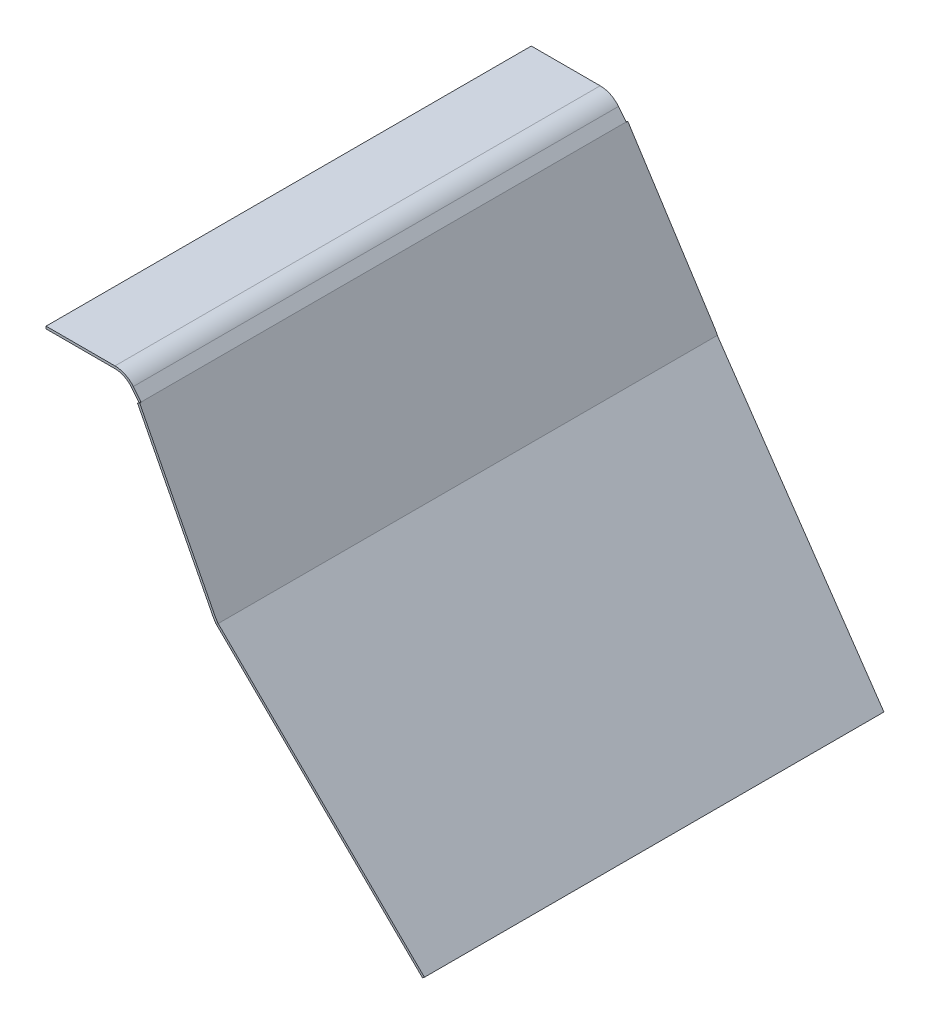
ISO-10303-21;
HEADER;
FILE_DESCRIPTION(('STEP AP214'),'2;1');
FILE_NAME('part.step','',(''),(''),'','','');
FILE_SCHEMA(('AUTOMOTIVE_DESIGN { 1 0 10303 214 1 1 1 1 }'));
ENDSEC;
DATA;
#1=APPLICATION_CONTEXT('core data for automotive mechanical design processes');
#2=APPLICATION_PROTOCOL_DEFINITION('international standard','automotive_design',2000,#1);
#3=PRODUCT_CONTEXT('',#1,'mechanical');
#4=PRODUCT('Part','Part','',(#3));
#5=PRODUCT_RELATED_PRODUCT_CATEGORY('part','',(#4));
#6=PRODUCT_DEFINITION_FORMATION('','',#4);
#7=PRODUCT_DEFINITION_CONTEXT('part definition',#1,'design');
#8=PRODUCT_DEFINITION('design','',#6,#7);
#9=PRODUCT_DEFINITION_SHAPE('','',#8);
#10=(LENGTH_UNIT() NAMED_UNIT(*) SI_UNIT(.MILLI.,.METRE.));
#11=(NAMED_UNIT(*) PLANE_ANGLE_UNIT() SI_UNIT($,.RADIAN.));
#12=(NAMED_UNIT(*) SI_UNIT($,.STERADIAN.) SOLID_ANGLE_UNIT());
#13=UNCERTAINTY_MEASURE_WITH_UNIT(LENGTH_MEASURE(1.E-05),#10,'distance_accuracy_value','');
#14=(GEOMETRIC_REPRESENTATION_CONTEXT(3) GLOBAL_UNCERTAINTY_ASSIGNED_CONTEXT((#13)) GLOBAL_UNIT_ASSIGNED_CONTEXT((#10,
#11,#12)) REPRESENTATION_CONTEXT('',''));
#15=CARTESIAN_POINT('',(0.,0.,0.));
#16=DIRECTION('',(0.,0.,1.));
#17=DIRECTION('',(1.,0.,0.));
#18=AXIS2_PLACEMENT_3D('',#15,#16,#17);
#19=CARTESIAN_POINT('',(209.743213645156,98.1461517212022,0.));
#20=DIRECTION('',(0.641429269385998,-0.767182176783941,0.));
#21=DIRECTION('',(0.,0.,1.));
#22=AXIS2_PLACEMENT_3D('',#19,#20,#21);
#23=PLANE('',#22);
#24=DIRECTION('',(0.,0.,1.));
#25=VECTOR('',#24,1.);
#26=CARTESIAN_POINT('',(212.044760175508,100.07043952936,0.));
#27=LINE('',#26,#25);
#28=CARTESIAN_POINT('',(212.044760175508,100.07043952936,-285.000000000001));
#29=VERTEX_POINT('',#28);
#30=CARTESIAN_POINT('',(212.044760175508,100.07043952936,285.000000000001));
#31=VERTEX_POINT('',#30);
#32=EDGE_CURVE('E215',#29,#31,#27,.T.);
#33=ORIENTED_EDGE('',*,*,#32,.T.);
#34=DIRECTION('',(-0.767182176783941,-0.641429269385998,0.));
#35=VECTOR('',#34,1.);
#36=CARTESIAN_POINT('',(209.743213645156,98.1461517212022,285.));
#37=LINE('',#36,#35);
#38=CARTESIAN_POINT('',(209.743213645156,98.1461517212022,285.));
#39=VERTEX_POINT('',#38);
#40=EDGE_CURVE('E444',#31,#39,#37,.T.);
#41=ORIENTED_EDGE('',*,*,#40,.T.);
#42=DIRECTION('',(0.,0.,1.));
#43=VECTOR('',#42,1.);
#44=CARTESIAN_POINT('',(209.743213645156,98.1461517212022,0.));
#45=LINE('',#44,#43);
#46=CARTESIAN_POINT('',(209.743213645156,98.1461517212022,-285.));
#47=VERTEX_POINT('',#46);
#48=EDGE_CURVE('E496',#47,#39,#45,.T.);
#49=ORIENTED_EDGE('',*,*,#48,.F.);
#50=DIRECTION('',(-0.767182176783941,-0.641429269385998,0.));
#51=VECTOR('',#50,1.);
#52=CARTESIAN_POINT('',(209.743213645156,98.1461517212022,-285.));
#53=LINE('',#52,#51);
#54=EDGE_CURVE('E622',#29,#47,#53,.T.);
#55=ORIENTED_EDGE('',*,*,#54,.F.);
#56=EDGE_LOOP('',(#33,#41,#49,#55));
#57=FACE_BOUND('',#56,.T.);
#58=ADVANCED_FACE('F85',(#57),#23,.T.);
#59=CARTESIAN_POINT('',(-241.358736931109,577.884576894634,0.));
#60=DIRECTION('',(-1.,0.,0.));
#61=DIRECTION('',(0.,0.,1.));
#62=AXIS2_PLACEMENT_3D('',#59,#60,#61);
#63=PLANE('',#62);
#64=DIRECTION('',(0.,0.,1.));
#65=VECTOR('',#64,1.);
#66=CARTESIAN_POINT('',(-241.358736931109,577.884576894634,0.));
#67=LINE('',#66,#65);
#68=CARTESIAN_POINT('',(-241.358736931109,577.884576894634,-300.952995997496));
#69=VERTEX_POINT('',#68);
#70=CARTESIAN_POINT('',(-241.358736931109,577.884576894634,300.952995997496));
#71=VERTEX_POINT('',#70);
#72=EDGE_CURVE('E533',#69,#71,#67,.T.);
#73=ORIENTED_EDGE('',*,*,#72,.T.);
#74=DIRECTION('',(0.,-1.,0.));
#75=VECTOR('',#74,1.);
#76=CARTESIAN_POINT('',(-241.358736931109,577.884576894634,300.952995997496));
#77=LINE('',#76,#75);
#78=CARTESIAN_POINT('',(-241.358736931109,580.884576894634,300.952995997496));
#79=VERTEX_POINT('',#78);
#80=EDGE_CURVE('E441',#79,#71,#77,.T.);
#81=ORIENTED_EDGE('',*,*,#80,.F.);
#82=DIRECTION('',(0.,0.,1.));
#83=VECTOR('',#82,1.);
#84=CARTESIAN_POINT('',(-241.358736931109,580.884576894634,0.));
#85=LINE('',#84,#83);
#86=CARTESIAN_POINT('',(-241.358736931109,580.884576894634,-300.952995997496));
#87=VERTEX_POINT('',#86);
#88=EDGE_CURVE('E235',#87,#79,#85,.T.);
#89=ORIENTED_EDGE('',*,*,#88,.F.);
#90=DIRECTION('',(0.,-1.,0.));
#91=VECTOR('',#90,1.);
#92=CARTESIAN_POINT('',(-241.358736931109,577.884576894634,-300.952995997496));
#93=LINE('',#92,#91);
#94=EDGE_CURVE('E183',#87,#69,#93,.T.);
#95=ORIENTED_EDGE('',*,*,#94,.T.);
#96=EDGE_LOOP('',(#73,#81,#89,#95));
#97=FACE_BOUND('',#96,.T.);
#98=ADVANCED_FACE('F551',(#97),#63,.T.);
#99=CARTESIAN_POINT('',(-21.1590178810777,374.015187085024,309.688443321264));
#100=DIRECTION('',(-0.867059278597065,-0.498204985321039,0.));
#101=DIRECTION('',(-0.497928585571312,0.866578241725369,-0.0333057748614185));
#102=AXIS2_PLACEMENT_3D('',#99,#100,#101);
#103=PLANE('',#102);
#104=DIRECTION('',(0.,0.,-1.));
#105=VECTOR('',#104,1.);
#106=CARTESIAN_POINT('',(-21.7135315129137,374.980244047033,285.));
#107=LINE('',#106,#105);
#108=CARTESIAN_POINT('',(-21.7135315129137,374.980244047033,309.612526278433));
#109=VERTEX_POINT('',#108);
#110=CARTESIAN_POINT('',(-21.7135315129137,374.980244047033,-309.612526278433));
#111=VERTEX_POINT('',#110);
#112=EDGE_CURVE('E301',#109,#111,#107,.T.);
#113=ORIENTED_EDGE('',*,*,#112,.F.);
#114=CARTESIAN_POINT('',(-21.7135315129137,374.980244047033,309.76141545248));
#115=CARTESIAN_POINT('',(-21.7135315129137,374.980244047033,309.612526278433));
#116=B_SPLINE_CURVE_WITH_KNOTS('',1,(#114,#115),.UNSPECIFIED.,.F.,.F.,(2,2),(0.,1.),.UNSPECIFIED.);
#117=CARTESIAN_POINT('',(-21.7135315226112,374.980244063911,309.76141545248));
#118=VERTEX_POINT('',#117);
#119=EDGE_CURVE('E293',#109,#118,#116,.F.);
#120=ORIENTED_EDGE('',*,*,#119,.T.);
#121=CARTESIAN_POINT('',(-21.1590178810778,374.015187085024,309.688443321264));
#122=CARTESIAN_POINT('',(-21.5151736381852,374.635028642062,309.740319750105));
#123=CARTESIAN_POINT('',(-22.2281801415258,375.875921291949,309.824856822683));
#124=CARTESIAN_POINT('',(-23.2989992330368,377.73953899219,309.893922449961));
#125=CARTESIAN_POINT('',(-24.3703481200894,379.60407873086,309.905199289458));
#126=CARTESIAN_POINT('',(-25.0844202129611,380.846825897094,309.87418629294));
#127=CARTESIAN_POINT('',(-35.9675048041198,399.787381998596,309.107714617116));
#128=CARTESIAN_POINT('',(-57.0199392885851,436.426334226362,307.62503802811));
#129=CARTESIAN_POINT('',(-88.598583043852,491.384748694799,305.40102370601));
#130=CARTESIAN_POINT('',(-120.177221484835,546.343153914435,303.177009758185));
#131=CARTESIAN_POINT('',(-141.22964534073,582.982087644593,301.694333917726));
#132=CARTESIAN_POINT('',(-151.755857268678,601.301554509672,300.952995997496));
#133=B_SPLINE_CURVE_WITH_KNOTS('',3,(#121,#122,#123,#124,#125,#126,#127,#128,#129,#130,#131,
#132),.UNSPECIFIED.,.F.,.F.,(4,1,1,1,2,1,1,1,4),(0.,0.0081977121129919,0.0163954242259838,
0.0245931363389757,0.0327908484519676,0.274593136338976,0.516395424225984,0.758197712112992,1.),.UNSPECIFIED.);
#134=CARTESIAN_POINT('',(-126.038820175659,556.544484053707,302.764190273605));
#135=VERTEX_POINT('',#134);
#136=EDGE_CURVE('E297',#135,#118,#133,.F.);
#137=ORIENTED_EDGE('',*,*,#136,.F.);
#138=CARTESIAN_POINT('',(-126.038820175659,556.544484053707,300.952995997496));
#139=CARTESIAN_POINT('',(-126.038820175659,556.544484053708,302.764190273605));
#140=B_SPLINE_CURVE_WITH_KNOTS('',1,(#138,#139),.UNSPECIFIED.,.F.,.F.,(2,2),(0.,1.),.UNSPECIFIED.);
#141=CARTESIAN_POINT('',(-126.038820175659,556.544484053707,300.952995997496));
#142=VERTEX_POINT('',#141);
#143=EDGE_CURVE('E309',#142,#135,#140,.T.);
#144=ORIENTED_EDGE('',*,*,#143,.F.);
#145=DIRECTION('',(0.,0.,-1.));
#146=VECTOR('',#145,1.);
#147=CARTESIAN_POINT('',(-126.038820175659,556.544484053708,309.688443321264));
#148=LINE('',#147,#146);
#149=CARTESIAN_POINT('',(-126.038820175659,556.544484053707,-300.952995997496));
#150=VERTEX_POINT('',#149);
#151=EDGE_CURVE('E514',#142,#150,#148,.T.);
#152=ORIENTED_EDGE('',*,*,#151,.T.);
#153=CARTESIAN_POINT('',(-126.038820175659,556.544484053707,-300.952995997496));
#154=CARTESIAN_POINT('',(-126.038820175659,556.544484053708,-302.764190273605));
#155=B_SPLINE_CURVE_WITH_KNOTS('',1,(#153,#154),.UNSPECIFIED.,.F.,.F.,(2,2),(0.,1.),.UNSPECIFIED.);
#156=CARTESIAN_POINT('',(-126.038820175659,556.544484053707,-302.764190273605));
#157=VERTEX_POINT('',#156);
#158=EDGE_CURVE('E511',#150,#157,#155,.T.);
#159=ORIENTED_EDGE('',*,*,#158,.T.);
#160=CARTESIAN_POINT('',(-21.1590178810778,374.015187085024,-309.688443321264));
#161=CARTESIAN_POINT('',(-21.5151736381852,374.635028642062,-309.740319750105));
#162=CARTESIAN_POINT('',(-22.2281801415258,375.875921291949,-309.824856822683));
#163=CARTESIAN_POINT('',(-23.2989992330368,377.73953899219,-309.893922449961));
#164=CARTESIAN_POINT('',(-24.3703481200894,379.60407873086,-309.905199289458));
#165=CARTESIAN_POINT('',(-25.0844202129611,380.846825897094,-309.87418629294));
#166=CARTESIAN_POINT('',(-35.9675048041198,399.787381998596,-309.107714617116));
#167=CARTESIAN_POINT('',(-57.0199392885851,436.426334226362,-307.62503802811));
#168=CARTESIAN_POINT('',(-88.598583043852,491.384748694799,-305.40102370601));
#169=CARTESIAN_POINT('',(-120.177221484835,546.343153914435,-303.177009758185));
#170=CARTESIAN_POINT('',(-141.22964534073,582.982087644593,-301.694333917726));
#171=CARTESIAN_POINT('',(-151.755857268678,601.301554509672,-300.952995997496));
#172=B_SPLINE_CURVE_WITH_KNOTS('',3,(#160,#161,#162,#163,#164,#165,#166,#167,#168,#169,#170,
#171),.UNSPECIFIED.,.F.,.F.,(4,1,1,1,2,1,1,1,4),(0.,0.0081977121129919,0.0163954242259838,
0.0245931363389757,0.0327908484519676,0.274593136338976,0.516395424225984,0.758197712112992,1.),.UNSPECIFIED.);
#173=CARTESIAN_POINT('',(-21.7135315226112,374.980244063911,-309.76141545248));
#174=VERTEX_POINT('',#173);
#175=EDGE_CURVE('E498',#157,#174,#172,.F.);
#176=ORIENTED_EDGE('',*,*,#175,.T.);
#177=CARTESIAN_POINT('',(-21.7135315129137,374.980244047033,-309.612526278433));
#178=CARTESIAN_POINT('',(-21.7135315129137,374.980244047033,-309.76141545248));
#179=B_SPLINE_CURVE_WITH_KNOTS('',1,(#177,#178),.UNSPECIFIED.,.F.,.F.,(2,2),(0.,1.),.UNSPECIFIED.);
#180=EDGE_CURVE('E510',#111,#174,#179,.T.);
#181=ORIENTED_EDGE('',*,*,#180,.F.);
#182=EDGE_LOOP('',(#113,#120,#137,#144,#152,#159,#176,#181));
#183=FACE_BOUND('',#182,.T.);
#184=ADVANCED_FACE('F294',(#183),#103,.T.);
#185=CARTESIAN_POINT('',(209.743213645156,98.1461517212022,285.));
#186=DIRECTION('',(-0.767182176783941,-0.641429269385998,0.));
#187=DIRECTION('',(-0.639942386067249,0.765403788369902,0.0680498586593641));
#188=AXIS2_PLACEMENT_3D('',#185,#186,#187);
#189=PLANE('',#188);
#190=ORIENTED_EDGE('',*,*,#48,.T.);
#191=DIRECTION('',(0.639942386067249,-0.765403788369901,-0.0680498586593638));
#192=VECTOR('',#191,1.);
#193=CARTESIAN_POINT('',(93.6578782855257,236.990143606926,297.344221660632));
#194=LINE('',#193,#192);
#195=EDGE_CURVE('E313',#109,#39,#194,.T.);
#196=ORIENTED_EDGE('',*,*,#195,.F.);
#197=ORIENTED_EDGE('',*,*,#112,.T.);
#198=DIRECTION('',(0.639942386067249,-0.765403788369901,0.0680498586593638));
#199=VECTOR('',#198,1.);
#200=CARTESIAN_POINT('',(93.6578782855257,236.990143606926,-297.344221660632));
#201=LINE('',#200,#199);
#202=EDGE_CURVE('E499',#111,#47,#201,.T.);
#203=ORIENTED_EDGE('',*,*,#202,.T.);
#204=EDGE_LOOP('',(#190,#196,#197,#203));
#205=FACE_BOUND('',#204,.T.);
#206=ADVANCED_FACE('F618',(#205),#189,.T.);
#207=CARTESIAN_POINT('',(-155.918615061957,577.884576894634,0.));
#208=DIRECTION('',(0.,1.,0.));
#209=DIRECTION('',(0.,0.,1.));
#210=AXIS2_PLACEMENT_3D('',#207,#208,#209);
#211=PLANE('',#210);
#212=DIRECTION('',(0.,0.,1.));
#213=VECTOR('',#212,1.);
#214=CARTESIAN_POINT('',(-155.918615061957,577.884576894634,0.));
#215=LINE('',#214,#213);
#216=CARTESIAN_POINT('',(-155.918615061957,577.884576894634,-300.952995997496));
#217=VERTEX_POINT('',#216);
#218=CARTESIAN_POINT('',(-155.918615061957,577.884576894634,300.952995997496));
#219=VERTEX_POINT('',#218);
#220=EDGE_CURVE('E532',#217,#219,#215,.T.);
#221=ORIENTED_EDGE('',*,*,#220,.T.);
#222=DIRECTION('',(-1.,0.,0.));
#223=VECTOR('',#222,1.);
#224=CARTESIAN_POINT('',(-155.918615061957,577.884576894634,300.952995997496));
#225=LINE('',#224,#223);
#226=EDGE_CURVE('E319',#219,#71,#225,.T.);
#227=ORIENTED_EDGE('',*,*,#226,.T.);
#228=ORIENTED_EDGE('',*,*,#72,.F.);
#229=DIRECTION('',(-1.,0.,0.));
#230=VECTOR('',#229,1.);
#231=CARTESIAN_POINT('',(-155.918615061957,577.884576894634,-300.952995997496));
#232=LINE('',#231,#230);
#233=EDGE_CURVE('E519',#217,#69,#232,.T.);
#234=ORIENTED_EDGE('',*,*,#233,.F.);
#235=EDGE_LOOP('',(#221,#227,#228,#234));
#236=FACE_BOUND('',#235,.T.);
#237=ADVANCED_FACE('F254',(#236),#211,.F.);
#238=CARTESIAN_POINT('',(-155.918615061957,551.565809461977,0.));
#239=DIRECTION('',(0.,0.,1.));
#240=DIRECTION('',(1.,0.,0.));
#241=AXIS2_PLACEMENT_3D('',#238,#239,#240);
#242=CYLINDRICAL_SURFACE('',#241,26.3187674326566);
#243=DIRECTION('',(0.,0.,1.));
#244=VECTOR('',#243,1.);
#245=CARTESIAN_POINT('',(-135.504299198674,568.17704743536,0.));
#246=LINE('',#245,#244);
#247=CARTESIAN_POINT('',(-135.504299198674,568.17704743536,-300.952995997496));
#248=VERTEX_POINT('',#247);
#249=CARTESIAN_POINT('',(-135.504299198674,568.17704743536,300.952995997496));
#250=VERTEX_POINT('',#249);
#251=EDGE_CURVE('E525',#248,#250,#246,.T.);
#252=ORIENTED_EDGE('',*,*,#251,.T.);
#253=CARTESIAN_POINT('',(-155.918615061957,551.565809461977,300.952995997496));
#254=DIRECTION('',(0.,0.,1.));
#255=DIRECTION('',(1.,0.,0.));
#256=AXIS2_PLACEMENT_3D('',#253,#254,#255);
#257=CIRCLE('',#256,26.3187674326566);
#258=EDGE_CURVE('E335',#250,#219,#257,.T.);
#259=ORIENTED_EDGE('',*,*,#258,.T.);
#260=ORIENTED_EDGE('',*,*,#220,.F.);
#261=CARTESIAN_POINT('',(-155.918615061957,551.565809461977,-300.952995997496));
#262=DIRECTION('',(0.,0.,1.));
#263=DIRECTION('',(1.,0.,0.));
#264=AXIS2_PLACEMENT_3D('',#261,#262,#263);
#265=CIRCLE('',#264,26.3187674326566);
#266=EDGE_CURVE('E526',#248,#217,#265,.T.);
#267=ORIENTED_EDGE('',*,*,#266,.F.);
#268=EDGE_LOOP('',(#252,#259,#260,#267));
#269=FACE_BOUND('',#268,.T.);
#270=ADVANCED_FACE('F723',(#269),#242,.F.);
#271=CARTESIAN_POINT('',(-135.504299198674,568.17704743536,0.));
#272=DIRECTION('',(0.775656227652702,0.631155619877998,0.));
#273=DIRECTION('',(-0.631155619877998,0.775656227652702,0.));
#274=AXIS2_PLACEMENT_3D('',#271,#272,#273);
#275=PLANE('',#274);
#276=ORIENTED_EDGE('',*,*,#151,.F.);
#277=DIRECTION('',(-0.631155619877998,0.775656227652702,0.));
#278=VECTOR('',#277,1.);
#279=CARTESIAN_POINT('',(-135.504299198674,568.17704743536,300.952995997496));
#280=LINE('',#279,#278);
#281=EDGE_CURVE('E338',#142,#250,#280,.T.);
#282=ORIENTED_EDGE('',*,*,#281,.T.);
#283=ORIENTED_EDGE('',*,*,#251,.F.);
#284=DIRECTION('',(-0.631155619877998,0.775656227652702,0.));
#285=VECTOR('',#284,1.);
#286=CARTESIAN_POINT('',(-135.504299198674,568.17704743536,-300.952995997496));
#287=LINE('',#286,#285);
#288=EDGE_CURVE('E529',#150,#248,#287,.T.);
#289=ORIENTED_EDGE('',*,*,#288,.F.);
#290=EDGE_LOOP('',(#276,#282,#283,#289));
#291=FACE_BOUND('',#290,.T.);
#292=ADVANCED_FACE('F253',(#291),#275,.F.);
#293=CARTESIAN_POINT('',(-18.5578400452865,375.509802040987,309.688443321264));
#294=DIRECTION('',(-0.867059278597065,-0.498204985321039,0.));
#295=DIRECTION('',(-0.497928585571312,0.866578241725369,-0.0333057748614185));
#296=AXIS2_PLACEMENT_3D('',#293,#294,#295);
#297=PLANE('',#296);
#298=DIRECTION('',(0.,0.,-1.));
#299=VECTOR('',#298,1.);
#300=CARTESIAN_POINT('',(-123.558606685829,558.249621307992,309.688443321264));
#301=LINE('',#300,#299);
#302=CARTESIAN_POINT('',(-123.558606685829,558.249621307992,300.952995997496));
#303=VERTEX_POINT('',#302);
#304=CARTESIAN_POINT('',(-123.558606685829,558.249621307992,-300.952995997496));
#305=VERTEX_POINT('',#304);
#306=EDGE_CURVE('E150',#303,#305,#301,.T.);
#307=ORIENTED_EDGE('',*,*,#306,.F.);
#308=CARTESIAN_POINT('',(-123.558606685829,558.249621307992,300.952995997496));
#309=DIRECTION('',(0.249102492660549,-0.433529639298586,0.866025403784403));
#310=VECTOR('',#309,1.);
#311=LINE('',#308,#310);
#312=CARTESIAN_POINT('',(-123.437642339868,558.039099009671,301.373538543802));
#313=VERTEX_POINT('',#312);
#314=EDGE_CURVE('E349',#303,#313,#311,.T.);
#315=ORIENTED_EDGE('',*,*,#314,.T.);
#316=CARTESIAN_POINT('',(-123.437642339868,558.039099009671,289.374167568056));
#317=CARTESIAN_POINT('',(-123.437642339868,558.039099009671,292.255188852862));
#318=CARTESIAN_POINT('',(-123.437642339868,558.039099009671,294.471359071944));
#319=CARTESIAN_POINT('',(-123.437642339868,558.039099009671,296.176105394315));
#320=CARTESIAN_POINT('',(-123.437642339868,558.039099009671,297.487448719215));
#321=CARTESIAN_POINT('',(-123.437642339868,558.039099009671,298.496174353754));
#322=CARTESIAN_POINT('',(-123.437642339868,558.039099009671,299.272117149553));
#323=CARTESIAN_POINT('',(-123.437642339868,558.039099009671,299.868996223245));
#324=CARTESIAN_POINT('',(-123.437642339868,558.039099009671,300.328133972239));
#325=CARTESIAN_POINT('',(-123.437642339868,558.039099009671,300.68131685608));
#326=CARTESIAN_POINT('',(-123.437642339868,558.039099009671,300.952995997496));
#327=CARTESIAN_POINT('',(-123.437642339868,558.039099009671,302.764190273605));
#328=CARTESIAN_POINT('',(-123.437642339868,558.039099009671,303.035869415022));
#329=CARTESIAN_POINT('',(-123.437642339868,558.039099009671,303.389052298863));
#330=CARTESIAN_POINT('',(-123.437642339868,558.039099009671,303.848190047856));
#331=CARTESIAN_POINT('',(-123.437642339868,558.039099009671,304.445069121548));
#332=CARTESIAN_POINT('',(-123.437642339868,558.039099009671,305.221011917347));
#333=CARTESIAN_POINT('',(-123.437642339868,558.039099009671,306.229737551886));
#334=CARTESIAN_POINT('',(-123.437642339868,558.039099009671,307.541080876787));
#335=CARTESIAN_POINT('',(-123.437642339868,558.039099009671,309.245827199157));
#336=CARTESIAN_POINT('',(-123.437642339868,558.039099009671,311.461997418239));
#337=CARTESIAN_POINT('',(-123.437642339868,558.039099009671,314.343018703046));
#338=B_SPLINE_CURVE_WITH_KNOTS('',1,(#316,#317,#318,#319,#320,#321,#322,#323,#324,#325,#326,
#327,#328,#329,#330,#331,#332,#333,#334,#335,#336,#337),.UNSPECIFIED.,.F.,.F.,(2,1,1,1,1,1,1,1,
1,1,1,1,1,1,1,1,1,1,1,1,1,2),(-6.39292459245,-4.8022496865,-3.578653605,-2.63742585,-1.9134045,
-1.356465,-0.92805,-0.5985,-0.345,-0.15,0.,1.,1.15,1.345,1.5985,1.92805,2.356465,2.9134045,
3.63742585,4.578653605,5.8022496865,7.39292459245),.UNSPECIFIED.);
#339=CARTESIAN_POINT('',(-123.437642339868,558.039099009671,302.764190273605));
#340=VERTEX_POINT('',#339);
#341=EDGE_CURVE('E346',#313,#340,#338,.T.);
#342=ORIENTED_EDGE('',*,*,#341,.T.);
#343=CARTESIAN_POINT('',(-18.5578400452866,375.509802040987,309.688443321264));
#344=CARTESIAN_POINT('',(-18.913995802394,376.129643598026,309.740319750105));
#345=CARTESIAN_POINT('',(-19.6270023057346,377.370536247912,309.824856822683));
#346=CARTESIAN_POINT('',(-20.6978213972456,379.234153948154,309.893922449961));
#347=CARTESIAN_POINT('',(-21.7691702842982,381.098693686823,309.905199289458));
#348=CARTESIAN_POINT('',(-22.4832423771699,382.341440853057,309.87418629294));
#349=CARTESIAN_POINT('',(-33.3663269683287,401.281996954559,309.107714617116));
#350=CARTESIAN_POINT('',(-54.4187614527939,437.920949182325,307.62503802811));
#351=CARTESIAN_POINT('',(-85.9974052080609,492.879363650762,305.40102370601));
#352=CARTESIAN_POINT('',(-117.576043649044,547.837768870398,303.177009758185));
#353=CARTESIAN_POINT('',(-138.628467504939,584.476702600556,301.694333917726));
#354=CARTESIAN_POINT('',(-149.154679432887,602.796169465636,300.952995997496));
#355=B_SPLINE_CURVE_WITH_KNOTS('',3,(#343,#344,#345,#346,#347,#348,#349,#350,#351,#352,#353,
#354),.UNSPECIFIED.,.F.,.F.,(4,1,1,1,2,1,1,1,4),(0.,0.0081977121129919,0.0163954242259838,
0.0245931363389757,0.0327908484519676,0.274593136338976,0.516395424225984,0.758197712112992,1.),.UNSPECIFIED.);
#356=CARTESIAN_POINT('',(-19.1926873174353,376.614668981357,309.770695351357));
#357=VERTEX_POINT('',#356);
#358=EDGE_CURVE('E350',#340,#357,#355,.F.);
#359=ORIENTED_EDGE('',*,*,#358,.T.);
#360=CARTESIAN_POINT('',(-19.2433411492099,376.702825214495,309.594593118709));
#361=CARTESIAN_POINT('',(-19.1926873174353,376.614668981357,309.770695351357));
#362=B_SPLINE_CURVE_WITH_KNOTS('',1,(#360,#361),.UNSPECIFIED.,.F.,.F.,(2,2),(0.,1.),.UNSPECIFIED.);
#363=CARTESIAN_POINT('',(-19.2433411492099,376.702825214495,309.594593118709));
#364=VERTEX_POINT('',#363);
#365=EDGE_CURVE('E279',#364,#357,#362,.T.);
#366=ORIENTED_EDGE('',*,*,#365,.F.);
#367=DIRECTION('',(0.,0.,-1.));
#368=VECTOR('',#367,1.);
#369=CARTESIAN_POINT('',(-19.2433411492099,376.702825214495,285.));
#370=LINE('',#369,#368);
#371=CARTESIAN_POINT('',(-19.2433411492099,376.702825214495,-309.594593118709));
#372=VERTEX_POINT('',#371);
#373=EDGE_CURVE('E216',#364,#372,#370,.T.);
#374=ORIENTED_EDGE('',*,*,#373,.T.);
#375=CARTESIAN_POINT('',(-19.1926873174353,376.614668981357,-309.770695351357));
#376=CARTESIAN_POINT('',(-19.2433411492099,376.702825214495,-309.594593118709));
#377=B_SPLINE_CURVE_WITH_KNOTS('',1,(#375,#376),.UNSPECIFIED.,.F.,.F.,(2,2),(0.,1.),.UNSPECIFIED.);
#378=CARTESIAN_POINT('',(-19.1926873174353,376.614668981357,-309.770695351357));
#379=VERTEX_POINT('',#378);
#380=EDGE_CURVE('E190',#372,#379,#377,.F.);
#381=ORIENTED_EDGE('',*,*,#380,.T.);
#382=CARTESIAN_POINT('',(-18.5578400452866,375.509802040987,-309.688443321264));
#383=CARTESIAN_POINT('',(-18.913995802394,376.129643598026,-309.740319750105));
#384=CARTESIAN_POINT('',(-19.6270023057346,377.370536247912,-309.824856822683));
#385=CARTESIAN_POINT('',(-20.6978213972456,379.234153948154,-309.893922449961));
#386=CARTESIAN_POINT('',(-21.7691702842982,381.098693686823,-309.905199289458));
#387=CARTESIAN_POINT('',(-22.4832423771699,382.341440853057,-309.87418629294));
#388=CARTESIAN_POINT('',(-33.3663269683287,401.281996954559,-309.107714617116));
#389=CARTESIAN_POINT('',(-54.4187614527939,437.920949182325,-307.62503802811));
#390=CARTESIAN_POINT('',(-85.9974052080609,492.879363650762,-305.40102370601));
#391=CARTESIAN_POINT('',(-117.576043649044,547.837768870398,-303.177009758185));
#392=CARTESIAN_POINT('',(-138.628467504939,584.476702600556,-301.694333917726));
#393=CARTESIAN_POINT('',(-149.154679432887,602.796169465636,-300.952995997496));
#394=B_SPLINE_CURVE_WITH_KNOTS('',3,(#382,#383,#384,#385,#386,#387,#388,#389,#390,#391,#392,
#393),.UNSPECIFIED.,.F.,.F.,(4,1,1,1,2,1,1,1,4),(0.,0.0081977121129919,0.0163954242259838,
0.0245931363389757,0.0327908484519676,0.274593136338976,0.516395424225984,0.758197712112992,1.),.UNSPECIFIED.);
#395=CARTESIAN_POINT('',(-123.437642339868,558.039099009671,-302.764190273605));
#396=VERTEX_POINT('',#395);
#397=EDGE_CURVE('E166',#396,#379,#394,.F.);
#398=ORIENTED_EDGE('',*,*,#397,.F.);
#399=CARTESIAN_POINT('',(-123.437642339868,558.039099009671,-289.374167568056));
#400=CARTESIAN_POINT('',(-123.437642339868,558.039099009671,-292.255188852862));
#401=CARTESIAN_POINT('',(-123.437642339868,558.039099009671,-294.471359071944));
#402=CARTESIAN_POINT('',(-123.437642339868,558.039099009671,-296.176105394315));
#403=CARTESIAN_POINT('',(-123.437642339868,558.039099009671,-297.487448719215));
#404=CARTESIAN_POINT('',(-123.437642339868,558.039099009671,-298.496174353754));
#405=CARTESIAN_POINT('',(-123.437642339868,558.039099009671,-299.272117149553));
#406=CARTESIAN_POINT('',(-123.437642339868,558.039099009671,-299.868996223245));
#407=CARTESIAN_POINT('',(-123.437642339868,558.039099009671,-300.328133972239));
#408=CARTESIAN_POINT('',(-123.437642339868,558.039099009671,-300.68131685608));
#409=CARTESIAN_POINT('',(-123.437642339868,558.039099009671,-300.952995997496));
#410=CARTESIAN_POINT('',(-123.437642339868,558.039099009671,-302.764190273605));
#411=CARTESIAN_POINT('',(-123.437642339868,558.039099009671,-303.035869415022));
#412=CARTESIAN_POINT('',(-123.437642339868,558.039099009671,-303.389052298863));
#413=CARTESIAN_POINT('',(-123.437642339868,558.039099009671,-303.848190047856));
#414=CARTESIAN_POINT('',(-123.437642339868,558.039099009671,-304.445069121548));
#415=CARTESIAN_POINT('',(-123.437642339868,558.039099009671,-305.221011917347));
#416=CARTESIAN_POINT('',(-123.437642339868,558.039099009671,-306.229737551886));
#417=CARTESIAN_POINT('',(-123.437642339868,558.039099009671,-307.541080876787));
#418=CARTESIAN_POINT('',(-123.437642339868,558.039099009671,-309.245827199157));
#419=CARTESIAN_POINT('',(-123.437642339868,558.039099009671,-311.461997418239));
#420=CARTESIAN_POINT('',(-123.437642339868,558.039099009671,-314.343018703046));
#421=B_SPLINE_CURVE_WITH_KNOTS('',1,(#399,#400,#401,#402,#403,#404,#405,#406,#407,#408,#409,
#410,#411,#412,#413,#414,#415,#416,#417,#418,#419,#420),.UNSPECIFIED.,.F.,.F.,(2,1,1,1,1,1,1,1,
1,1,1,1,1,1,1,1,1,1,1,1,1,2),(-6.39292459245,-4.8022496865,-3.578653605,-2.63742585,-1.9134045,
-1.356465,-0.92805,-0.5985,-0.345,-0.15,0.,1.,1.15,1.345,1.5985,1.92805,2.356465,2.9134045,
3.63742585,4.578653605,5.8022496865,7.39292459245),.UNSPECIFIED.);
#422=CARTESIAN_POINT('',(-123.437642339868,558.039099009671,-301.373538543802));
#423=VERTEX_POINT('',#422);
#424=EDGE_CURVE('E165',#423,#396,#421,.T.);
#425=ORIENTED_EDGE('',*,*,#424,.F.);
#426=CARTESIAN_POINT('',(-123.558606685829,558.249621307992,-300.952995997496));
#427=DIRECTION('',(0.249102492660522,-0.433529639298589,-0.86602540378441));
#428=VECTOR('',#427,1.);
#429=LINE('',#426,#428);
#430=EDGE_CURVE('E175',#305,#423,#429,.T.);
#431=ORIENTED_EDGE('',*,*,#430,.F.);
#432=EDGE_LOOP('',(#307,#315,#342,#359,#366,#374,#381,#398,#425,#431));
#433=FACE_BOUND('',#432,.T.);
#434=ADVANCED_FACE('F188',(#433),#297,.F.);
#435=CARTESIAN_POINT('',(212.044760175508,100.07043952936,285.));
#436=DIRECTION('',(-0.767182176783941,-0.641429269385998,0.));
#437=DIRECTION('',(-0.639942386067249,0.765403788369902,0.0680498586593641));
#438=AXIS2_PLACEMENT_3D('',#435,#436,#437);
#439=PLANE('',#438);
#440=ORIENTED_EDGE('',*,*,#373,.F.);
#441=DIRECTION('',(0.639942386067249,-0.765403788369901,-0.0680498586593638));
#442=VECTOR('',#441,1.);
#443=CARTESIAN_POINT('',(95.9594248158776,238.914431415084,297.344221660632));
#444=LINE('',#443,#442);
#445=EDGE_CURVE('E345',#364,#31,#444,.T.);
#446=ORIENTED_EDGE('',*,*,#445,.T.);
#447=ORIENTED_EDGE('',*,*,#32,.F.);
#448=DIRECTION('',(0.639942386067249,-0.765403788369901,0.0680498586593638));
#449=VECTOR('',#448,1.);
#450=CARTESIAN_POINT('',(95.9594248158776,238.914431415084,-297.344221660632));
#451=LINE('',#450,#449);
#452=EDGE_CURVE('E212',#372,#29,#451,.T.);
#453=ORIENTED_EDGE('',*,*,#452,.F.);
#454=EDGE_LOOP('',(#440,#446,#447,#453));
#455=FACE_BOUND('',#454,.T.);
#456=ADVANCED_FACE('F252',(#455),#439,.F.);
#457=CARTESIAN_POINT('',(-155.918615061957,580.884576894634,0.));
#458=DIRECTION('',(0.,1.,0.));
#459=DIRECTION('',(0.,0.,1.));
#460=AXIS2_PLACEMENT_3D('',#457,#458,#459);
#461=PLANE('',#460);
#462=ORIENTED_EDGE('',*,*,#88,.T.);
#463=DIRECTION('',(1.,0.,0.));
#464=VECTOR('',#463,1.);
#465=CARTESIAN_POINT('',(-155.918615061957,580.884576894634,300.952995997496));
#466=LINE('',#465,#464);
#467=CARTESIAN_POINT('',(-155.918615061957,580.884576894634,300.952995997496));
#468=VERTEX_POINT('',#467);
#469=EDGE_CURVE('E342',#468,#79,#466,.F.);
#470=ORIENTED_EDGE('',*,*,#469,.F.);
#471=DIRECTION('',(0.,0.,1.));
#472=VECTOR('',#471,1.);
#473=CARTESIAN_POINT('',(-155.918615061957,580.884576894634,0.));
#474=LINE('',#473,#472);
#475=CARTESIAN_POINT('',(-155.918615061957,580.884576894634,-300.952995997496));
#476=VERTEX_POINT('',#475);
#477=EDGE_CURVE('E540',#476,#468,#474,.T.);
#478=ORIENTED_EDGE('',*,*,#477,.F.);
#479=DIRECTION('',(1.,0.,0.));
#480=VECTOR('',#479,1.);
#481=CARTESIAN_POINT('',(-155.918615061957,580.884576894634,-300.952995997496));
#482=LINE('',#481,#480);
#483=EDGE_CURVE('E200',#476,#87,#482,.F.);
#484=ORIENTED_EDGE('',*,*,#483,.T.);
#485=EDGE_LOOP('',(#462,#470,#478,#484));
#486=FACE_BOUND('',#485,.T.);
#487=ADVANCED_FACE('F546',(#486),#461,.T.);
#488=CARTESIAN_POINT('',(-155.918615061957,551.565809461977,0.));
#489=DIRECTION('',(0.,0.,1.));
#490=DIRECTION('',(1.,0.,0.));
#491=AXIS2_PLACEMENT_3D('',#488,#489,#490);
#492=CYLINDRICAL_SURFACE('',#491,29.3187674326566);
#493=ORIENTED_EDGE('',*,*,#477,.T.);
#494=CARTESIAN_POINT('',(-155.918615061957,551.565809461977,300.952995997496));
#495=DIRECTION('',(0.,0.,1.));
#496=DIRECTION('',(1.,0.,0.));
#497=AXIS2_PLACEMENT_3D('',#494,#495,#496);
#498=CIRCLE('',#497,29.3187674326566);
#499=CARTESIAN_POINT('',(-133.177330515716,570.070514294994,300.952995997496));
#500=VERTEX_POINT('',#499);
#501=EDGE_CURVE('E339',#500,#468,#498,.T.);
#502=ORIENTED_EDGE('',*,*,#501,.F.);
#503=DIRECTION('',(0.,0.,1.));
#504=VECTOR('',#503,1.);
#505=CARTESIAN_POINT('',(-133.177330515716,570.070514294994,0.));
#506=LINE('',#505,#504);
#507=CARTESIAN_POINT('',(-133.177330515716,570.070514294994,-300.952995997496));
#508=VERTEX_POINT('',#507);
#509=EDGE_CURVE('E538',#508,#500,#506,.T.);
#510=ORIENTED_EDGE('',*,*,#509,.F.);
#511=CARTESIAN_POINT('',(-155.918615061957,551.565809461977,-300.952995997496));
#512=DIRECTION('',(0.,0.,1.));
#513=DIRECTION('',(1.,0.,0.));
#514=AXIS2_PLACEMENT_3D('',#511,#512,#513);
#515=CIRCLE('',#514,29.3187674326566);
#516=EDGE_CURVE('E197',#508,#476,#515,.T.);
#517=ORIENTED_EDGE('',*,*,#516,.T.);
#518=EDGE_LOOP('',(#493,#502,#510,#517));
#519=FACE_BOUND('',#518,.T.);
#520=ADVANCED_FACE('F735',(#519),#492,.T.);
#521=CARTESIAN_POINT('',(-133.177330515716,570.070514294994,0.));
#522=DIRECTION('',(0.775656227652702,0.631155619877998,0.));
#523=DIRECTION('',(-0.631155619877998,0.775656227652702,0.));
#524=AXIS2_PLACEMENT_3D('',#521,#522,#523);
#525=PLANE('',#524);
#526=ORIENTED_EDGE('',*,*,#509,.T.);
#527=DIRECTION('',(-0.631155619877998,0.775656227652702,0.));
#528=VECTOR('',#527,1.);
#529=CARTESIAN_POINT('',(-133.177330515716,570.070514294994,300.952995997496));
#530=LINE('',#529,#528);
#531=EDGE_CURVE('E159',#303,#500,#530,.T.);
#532=ORIENTED_EDGE('',*,*,#531,.F.);
#533=ORIENTED_EDGE('',*,*,#306,.T.);
#534=DIRECTION('',(-0.631155619877998,0.775656227652702,0.));
#535=VECTOR('',#534,1.);
#536=CARTESIAN_POINT('',(-133.177330515716,570.070514294994,-300.952995997496));
#537=LINE('',#536,#535);
#538=EDGE_CURVE('E155',#305,#508,#537,.T.);
#539=ORIENTED_EDGE('',*,*,#538,.T.);
#540=EDGE_LOOP('',(#526,#532,#533,#539));
#541=FACE_BOUND('',#540,.T.);
#542=ADVANCED_FACE('F153',(#541),#525,.T.);
#543=CARTESIAN_POINT('',(-19.2433411492099,376.702825214495,-309.594593118709));
#544=CARTESIAN_POINT('',(-21.7135315129137,374.980244047033,-309.612526278433));
#545=CARTESIAN_POINT('',(-19.1926873174353,376.614668981357,-309.770695351357));
#546=CARTESIAN_POINT('',(-21.7135315129137,374.980244047033,-309.76141545248));
#547=B_SPLINE_SURFACE_WITH_KNOTS('',1,1,((#543,#544),(#545,#546)),.UNSPECIFIED.,.F.,.F.,.F.,(2,
2),(2,2),(0.,1.),(0.,1.),.UNSPECIFIED.);
#548=CARTESIAN_POINT('',(-19.1926873174353,376.614668981357,-309.770695351357));
#549=CARTESIAN_POINT('',(-19.2977222990012,376.546567606193,-309.770315470931));
#550=CARTESIAN_POINT('',(-19.4027573044318,376.478466272565,-309.769934742712));
#551=CARTESIAN_POINT('',(-19.6128273632388,376.342263688753,-309.769171590713));
#552=CARTESIAN_POINT('',(-19.7178624166153,376.274162438569,-309.768789166932));
#553=CARTESIAN_POINT('',(-19.9279325715282,376.137960022017,-309.768022623836));
#554=CARTESIAN_POINT('',(-20.0329676730646,376.069858855649,-309.76763850452));
#555=CARTESIAN_POINT('',(-20.2430379245113,375.9336566071,-309.766868570377));
#556=CARTESIAN_POINT('',(-20.3480730744216,375.86555552492,-309.766482755551));
#557=CARTESIAN_POINT('',(-20.5581434228302,375.729353445121,-309.765709430413));
#558=CARTESIAN_POINT('',(-20.6631786213285,375.661252447502,-309.765321920102));
#559=CARTESIAN_POINT('',(-20.8732490671268,375.525050537197,-309.764545204021));
#560=CARTESIAN_POINT('',(-20.978284314427,375.456949624511,-309.764155998251));
#561=CARTESIAN_POINT('',(-21.1883548580431,375.320747884445,-309.763375891277));
#562=CARTESIAN_POINT('',(-21.2933901543592,375.252647057065,-309.762984990073));
#563=CARTESIAN_POINT('',(-21.5034607962212,375.116445487982,-309.762201492258));
#564=CARTESIAN_POINT('',(-21.6084961417671,375.04834474628,-309.761808895646));
#565=CARTESIAN_POINT('',(-21.713531512034,374.980244047604,-309.761415451343));
#566=B_SPLINE_CURVE_WITH_KNOTS('',3,(#548,#549,#550,#551,#552,#553,#554,#555,#556,#557,#558,
#559,#560,#561,#562,#563,#564,#565),.UNSPECIFIED.,.F.,.F.,(4,2,2,2,2,2,2,2,4),(0.,
0.375543074288562,0.751086148586195,1.12662922289261,1.50217229720756,1.87771537153068,
2.25325844586181,2.62880152020056,3.00434459454673),.UNSPECIFIED.);
#567=EDGE_CURVE('E13',#379,#174,#566,.T.);
#568=CARTESIAN_POINT('',(-19.2433411492099,376.702825214495,-309.594593118709));
#569=CARTESIAN_POINT('',(-21.7135315129137,374.980244047033,-309.612526278433));
#570=B_SPLINE_CURVE_WITH_KNOTS('',1,(#568,#569),.UNSPECIFIED.,.F.,.F.,(2,2),(0.,1.),.UNSPECIFIED.);
#571=EDGE_CURVE('E99',#372,#111,#570,.T.);
#572=ORIENTED_EDGE('',*,*,#567,.F.);
#573=ORIENTED_EDGE('',*,*,#380,.F.);
#574=ORIENTED_EDGE('',*,*,#571,.T.);
#575=ORIENTED_EDGE('',*,*,#180,.T.);
#576=EDGE_LOOP('',(#572,#573,#574,#575));
#577=FACE_BOUND('',#576,.T.);
#578=ADVANCED_FACE('F650',(#577),#547,.F.);
#579=CARTESIAN_POINT('',(93.6578782855257,236.990143606926,-297.344221660632));
#580=DIRECTION('',(0.0436491711216961,-0.0522066386961302,-0.997681921624543));
#581=DIRECTION('',(0.639942386067249,-0.765403788369901,0.0680498586593638));
#582=AXIS2_PLACEMENT_3D('',#579,#580,#581);
#583=PLANE('',#582);
#584=ORIENTED_EDGE('',*,*,#571,.F.);
#585=ORIENTED_EDGE('',*,*,#452,.T.);
#586=ORIENTED_EDGE('',*,*,#54,.T.);
#587=ORIENTED_EDGE('',*,*,#202,.F.);
#588=EDGE_LOOP('',(#584,#585,#586,#587));
#589=FACE_BOUND('',#588,.T.);
#590=ADVANCED_FACE('F669',(#589),#583,.T.);
#591=CARTESIAN_POINT('',(-135.504299198674,568.17704743536,-300.952995997496));
#592=DIRECTION('',(0.,0.,-1.));
#593=DIRECTION('',(-0.631155619877998,0.775656227652702,0.));
#594=AXIS2_PLACEMENT_3D('',#591,#592,#593);
#595=PLANE('',#594);
#596=ORIENTED_EDGE('',*,*,#288,.T.);
#597=ORIENTED_EDGE('',*,*,#266,.T.);
#598=ORIENTED_EDGE('',*,*,#233,.T.);
#599=ORIENTED_EDGE('',*,*,#94,.F.);
#600=ORIENTED_EDGE('',*,*,#483,.F.);
#601=ORIENTED_EDGE('',*,*,#516,.F.);
#602=ORIENTED_EDGE('',*,*,#538,.F.);
#603=CARTESIAN_POINT('',(-123.558606685829,558.249621307992,-300.952995997496));
#604=DIRECTION('',(-0.824043400814247,-0.566526675077608,0.));
#605=VECTOR('',#604,1.);
#606=LINE('',#603,#605);
#607=EDGE_CURVE('E172',#305,#150,#606,.T.);
#608=ORIENTED_EDGE('',*,*,#607,.T.);
#609=EDGE_LOOP('',(#596,#597,#598,#599,#600,#601,#602,#608));
#610=FACE_BOUND('',#609,.T.);
#611=ADVANCED_FACE('F194',(#610),#595,.T.);
#612=CARTESIAN_POINT('',(-123.558606685829,558.249621307992,-300.952995997496));
#613=DIRECTION('',(0.491026080122421,-0.714223740474573,0.498776339837928));
#614=DIRECTION('',(-0.871144872360281,-0.402576534331666,0.281138302914946));
#615=AXIS2_PLACEMENT_3D('',#612,#613,#614);
#616=PLANE('',#615);
#617=ORIENTED_EDGE('',*,*,#607,.F.);
#618=ORIENTED_EDGE('',*,*,#430,.T.);
#619=CARTESIAN_POINT('',(-123.437642339868,558.039099009671,-301.373538543802));
#620=DIRECTION('',(-0.858663664491633,-0.493380935910119,0.138823497154679));
#621=VECTOR('',#620,1.);
#622=LINE('',#619,#621);
#623=EDGE_CURVE('E177',#423,#150,#622,.T.);
#624=ORIENTED_EDGE('',*,*,#623,.T.);
#625=EDGE_LOOP('',(#617,#618,#624));
#626=FACE_BOUND('',#625,.T.);
#627=ADVANCED_FACE('F174',(#626),#616,.F.);
#628=CARTESIAN_POINT('',(-126.038820175659,556.544484053707,-300.952995997496));
#629=DIRECTION('',(-0.498204985321039,0.867059278597066,0.));
#630=DIRECTION('',(0.,0.,-1.));
#631=AXIS2_PLACEMENT_3D('',#628,#629,#630);
#632=PLANE('',#631);
#633=ORIENTED_EDGE('',*,*,#623,.F.);
#634=ORIENTED_EDGE('',*,*,#424,.T.);
#635=DIRECTION('',(-0.867059278597065,-0.498204985321039,0.));
#636=VECTOR('',#635,1.);
#637=CARTESIAN_POINT('',(-126.038820175659,556.544484053707,-302.764190273605));
#638=LINE('',#637,#636);
#639=EDGE_CURVE('E107',#396,#157,#638,.T.);
#640=ORIENTED_EDGE('',*,*,#639,.T.);
#641=ORIENTED_EDGE('',*,*,#158,.F.);
#642=EDGE_LOOP('',(#633,#634,#640,#641));
#643=FACE_BOUND('',#642,.T.);
#644=ADVANCED_FACE('F562',(#643),#632,.T.);
#645=DIRECTION('',(-0.867059278597065,-0.498204985321039,0.));
#646=VECTOR('',#645,1.);
#647=SURFACE_OF_LINEAR_EXTRUSION('',#172,#646);
#648=ORIENTED_EDGE('',*,*,#397,.T.);
#649=ORIENTED_EDGE('',*,*,#567,.T.);
#650=ORIENTED_EDGE('',*,*,#175,.F.);
#651=ORIENTED_EDGE('',*,*,#639,.F.);
#652=EDGE_LOOP('',(#648,#649,#650,#651));
#653=FACE_BOUND('',#652,.T.);
#654=ADVANCED_FACE('F87',(#653),#647,.F.);
#655=CARTESIAN_POINT('',(-19.2433411492099,376.702825214495,309.594593118709));
#656=CARTESIAN_POINT('',(-21.7135315129137,374.980244047033,309.612526278433));
#657=CARTESIAN_POINT('',(-19.1926873174353,376.614668981357,309.770695351357));
#658=CARTESIAN_POINT('',(-21.7135315129137,374.980244047033,309.76141545248));
#659=B_SPLINE_SURFACE_WITH_KNOTS('',1,1,((#655,#656),(#657,#658)),.UNSPECIFIED.,.F.,.F.,.F.,(2,
2),(2,2),(0.,1.),(0.,1.),.UNSPECIFIED.);
#660=CARTESIAN_POINT('',(-19.1926873174353,376.614668981357,309.770695351357));
#661=CARTESIAN_POINT('',(-21.7135315129137,374.980244047033,309.76141545248));
#662=B_SPLINE_CURVE_WITH_KNOTS('',1,(#660,#661),.UNSPECIFIED.,.F.,.F.,(2,2),(0.,1.),.UNSPECIFIED.);
#663=EDGE_CURVE('E198',#357,#118,#662,.T.);
#664=CARTESIAN_POINT('',(-21.7135315129137,374.980244047033,309.612526278433));
#665=CARTESIAN_POINT('',(-19.2433411492099,376.702825214495,309.594593118709));
#666=B_SPLINE_CURVE_WITH_KNOTS('',1,(#664,#665),.UNSPECIFIED.,.F.,.F.,(2,2),(0.,1.),.UNSPECIFIED.);
#667=EDGE_CURVE('E203',#364,#109,#666,.F.);
#668=ORIENTED_EDGE('',*,*,#663,.T.);
#669=ORIENTED_EDGE('',*,*,#119,.F.);
#670=ORIENTED_EDGE('',*,*,#667,.F.);
#671=ORIENTED_EDGE('',*,*,#365,.T.);
#672=EDGE_LOOP('',(#668,#669,#670,#671));
#673=FACE_BOUND('',#672,.T.);
#674=ADVANCED_FACE('F452',(#673),#659,.T.);
#675=CARTESIAN_POINT('',(93.6578782855257,236.990143606926,297.344221660632));
#676=DIRECTION('',(0.0436491711216961,-0.0522066386961302,0.997681921624543));
#677=DIRECTION('',(0.639942386067249,-0.765403788369901,-0.0680498586593638));
#678=AXIS2_PLACEMENT_3D('',#675,#676,#677);
#679=PLANE('',#678);
#680=ORIENTED_EDGE('',*,*,#667,.T.);
#681=ORIENTED_EDGE('',*,*,#195,.T.);
#682=ORIENTED_EDGE('',*,*,#40,.F.);
#683=ORIENTED_EDGE('',*,*,#445,.F.);
#684=EDGE_LOOP('',(#680,#681,#682,#683));
#685=FACE_BOUND('',#684,.T.);
#686=ADVANCED_FACE('F463',(#685),#679,.T.);
#687=CARTESIAN_POINT('',(-135.504299198674,568.17704743536,300.952995997496));
#688=DIRECTION('',(0.,0.,1.));
#689=DIRECTION('',(-0.631155619877998,0.775656227652702,0.));
#690=AXIS2_PLACEMENT_3D('',#687,#688,#689);
#691=PLANE('',#690);
#692=ORIENTED_EDGE('',*,*,#281,.F.);
#693=CARTESIAN_POINT('',(-123.558606685829,558.249621307992,300.952995997496));
#694=DIRECTION('',(-0.824043400814246,-0.56652667507761,0.));
#695=VECTOR('',#694,1.);
#696=LINE('',#693,#695);
#697=EDGE_CURVE('E439',#303,#142,#696,.T.);
#698=ORIENTED_EDGE('',*,*,#697,.F.);
#699=ORIENTED_EDGE('',*,*,#531,.T.);
#700=ORIENTED_EDGE('',*,*,#501,.T.);
#701=ORIENTED_EDGE('',*,*,#469,.T.);
#702=ORIENTED_EDGE('',*,*,#80,.T.);
#703=ORIENTED_EDGE('',*,*,#226,.F.);
#704=ORIENTED_EDGE('',*,*,#258,.F.);
#705=EDGE_LOOP('',(#692,#698,#699,#700,#701,#702,#703,#704));
#706=FACE_BOUND('',#705,.T.);
#707=ADVANCED_FACE('F395',(#706),#691,.T.);
#708=CARTESIAN_POINT('',(-123.558606685829,558.249621307992,300.952995997496));
#709=DIRECTION('',(0.491026080122421,-0.714223740474573,-0.498776339837928));
#710=DIRECTION('',(-0.871144872360281,-0.402576534331666,-0.281138302914946));
#711=AXIS2_PLACEMENT_3D('',#708,#709,#710);
#712=PLANE('',#711);
#713=ORIENTED_EDGE('',*,*,#697,.T.);
#714=CARTESIAN_POINT('',(-123.437642339868,558.039099009671,301.373538543802));
#715=DIRECTION('',(-0.858663664491631,-0.493380935910122,-0.13882349715468));
#716=VECTOR('',#715,1.);
#717=LINE('',#714,#716);
#718=EDGE_CURVE('E422',#313,#142,#717,.T.);
#719=ORIENTED_EDGE('',*,*,#718,.F.);
#720=ORIENTED_EDGE('',*,*,#314,.F.);
#721=EDGE_LOOP('',(#713,#719,#720));
#722=FACE_BOUND('',#721,.T.);
#723=ADVANCED_FACE('F384',(#722),#712,.F.);
#724=CARTESIAN_POINT('',(-126.038820175659,556.544484053707,300.952995997496));
#725=DIRECTION('',(-0.498204985321039,0.867059278597066,0.));
#726=DIRECTION('',(0.,0.,1.));
#727=AXIS2_PLACEMENT_3D('',#724,#725,#726);
#728=PLANE('',#727);
#729=ORIENTED_EDGE('',*,*,#718,.T.);
#730=ORIENTED_EDGE('',*,*,#143,.T.);
#731=DIRECTION('',(-0.867059278597065,-0.498204985321039,0.));
#732=VECTOR('',#731,1.);
#733=CARTESIAN_POINT('',(-126.038820175659,556.544484053707,302.764190273605));
#734=LINE('',#733,#732);
#735=EDGE_CURVE('E311',#340,#135,#734,.T.);
#736=ORIENTED_EDGE('',*,*,#735,.F.);
#737=ORIENTED_EDGE('',*,*,#341,.F.);
#738=EDGE_LOOP('',(#729,#730,#736,#737));
#739=FACE_BOUND('',#738,.T.);
#740=ADVANCED_FACE('F394',(#739),#728,.T.);
#741=DIRECTION('',(-0.867059278597065,-0.498204985321039,0.));
#742=VECTOR('',#741,1.);
#743=SURFACE_OF_LINEAR_EXTRUSION('',#133,#742);
#744=ORIENTED_EDGE('',*,*,#358,.F.);
#745=ORIENTED_EDGE('',*,*,#735,.T.);
#746=ORIENTED_EDGE('',*,*,#136,.T.);
#747=ORIENTED_EDGE('',*,*,#663,.F.);
#748=EDGE_LOOP('',(#744,#745,#746,#747));
#749=FACE_BOUND('',#748,.T.);
#750=ADVANCED_FACE('F465',(#749),#743,.T.);
#751=CLOSED_SHELL('',(#58,#98,#184,#206,#237,#270,#292,#434,#456,#487,#520,#542,#578,#590,#611,
#627,#644,#654,#674,#686,#707,#723,#740,#750));
#752=MANIFOLD_SOLID_BREP('B2',#751);
#753=ADVANCED_BREP_SHAPE_REPRESENTATION('',(#18,#752),#14);
#754=SHAPE_DEFINITION_REPRESENTATION(#9,#753);
ENDSEC;
END-ISO-10303-21;
